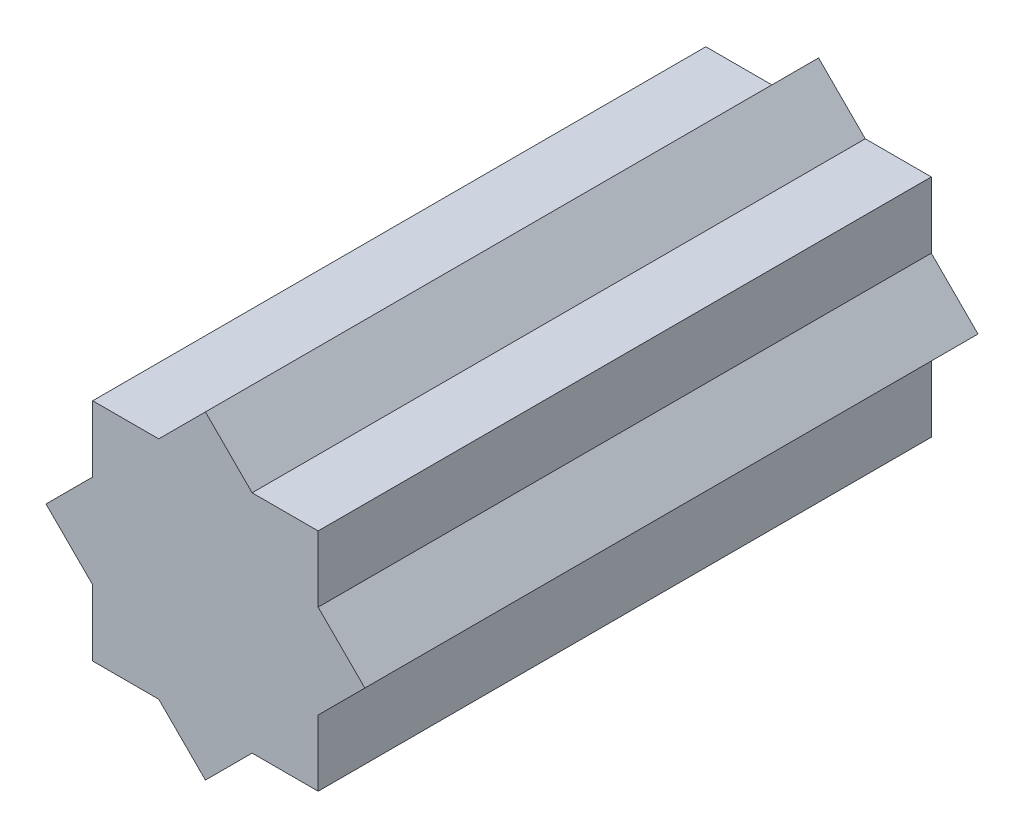
ISO-10303-21;
HEADER;
FILE_DESCRIPTION(('STEP AP214'),'2;1');
FILE_NAME('part.step','',(''),(''),'','','');
FILE_SCHEMA(('AUTOMOTIVE_DESIGN { 1 0 10303 214 1 1 1 1 }'));
ENDSEC;
DATA;
#1=APPLICATION_CONTEXT('core data for automotive mechanical design processes');
#2=APPLICATION_PROTOCOL_DEFINITION('international standard','automotive_design',2000,#1);
#3=PRODUCT_CONTEXT('',#1,'mechanical');
#4=PRODUCT('Part','Part','',(#3));
#5=PRODUCT_RELATED_PRODUCT_CATEGORY('part','',(#4));
#6=PRODUCT_DEFINITION_FORMATION('','',#4);
#7=PRODUCT_DEFINITION_CONTEXT('part definition',#1,'design');
#8=PRODUCT_DEFINITION('design','',#6,#7);
#9=PRODUCT_DEFINITION_SHAPE('','',#8);
#10=(LENGTH_UNIT() NAMED_UNIT(*) SI_UNIT(.MILLI.,.METRE.));
#11=(NAMED_UNIT(*) PLANE_ANGLE_UNIT() SI_UNIT($,.RADIAN.));
#12=(NAMED_UNIT(*) SI_UNIT($,.STERADIAN.) SOLID_ANGLE_UNIT());
#13=UNCERTAINTY_MEASURE_WITH_UNIT(LENGTH_MEASURE(1.E-05),#10,'distance_accuracy_value','');
#14=(GEOMETRIC_REPRESENTATION_CONTEXT(3) GLOBAL_UNCERTAINTY_ASSIGNED_CONTEXT((#13)) GLOBAL_UNIT_ASSIGNED_CONTEXT((#10,
#11,#12)) REPRESENTATION_CONTEXT('',''));
#15=CARTESIAN_POINT('',(0.,0.,0.));
#16=DIRECTION('',(0.,0.,1.));
#17=DIRECTION('',(1.,0.,0.));
#18=AXIS2_PLACEMENT_3D('',#15,#16,#17);
#19=CARTESIAN_POINT('',(-2.75771644662794,2.75771644662794,-7.5));
#20=DIRECTION('',(-1.,0.,0.));
#21=DIRECTION('',(0.,0.,1.));
#22=AXIS2_PLACEMENT_3D('',#19,#20,#21);
#23=PLANE('',#22);
#24=DIRECTION('',(0.,0.,1.));
#25=VECTOR('',#24,1.);
#26=CARTESIAN_POINT('',(-2.75771644662794,1.14228355337206,-7.5));
#27=LINE('',#26,#25);
#28=CARTESIAN_POINT('',(-2.75771644662794,1.14228355337206,-7.5));
#29=VERTEX_POINT('',#28);
#30=CARTESIAN_POINT('',(-2.75771644662794,1.14228355337206,7.5));
#31=VERTEX_POINT('',#30);
#32=EDGE_CURVE('E36',#29,#31,#27,.T.);
#33=ORIENTED_EDGE('',*,*,#32,.T.);
#34=DIRECTION('',(0.,-1.,0.));
#35=VECTOR('',#34,1.);
#36=CARTESIAN_POINT('',(-2.75771644662794,2.75771644662794,7.5));
#37=LINE('',#36,#35);
#38=CARTESIAN_POINT('',(-2.75771644662794,2.75771644662794,7.5));
#39=VERTEX_POINT('',#38);
#40=EDGE_CURVE('E145',#39,#31,#37,.T.);
#41=ORIENTED_EDGE('',*,*,#40,.F.);
#42=DIRECTION('',(0.,0.,1.));
#43=VECTOR('',#42,1.);
#44=CARTESIAN_POINT('',(-2.75771644662794,2.75771644662794,-7.5));
#45=LINE('',#44,#43);
#46=CARTESIAN_POINT('',(-2.75771644662794,2.75771644662794,-7.5));
#47=VERTEX_POINT('',#46);
#48=EDGE_CURVE('E11',#47,#39,#45,.T.);
#49=ORIENTED_EDGE('',*,*,#48,.F.);
#50=DIRECTION('',(0.,-1.,0.));
#51=VECTOR('',#50,1.);
#52=CARTESIAN_POINT('',(-2.75771644662794,2.75771644662794,-7.5));
#53=LINE('',#52,#51);
#54=EDGE_CURVE('E146',#47,#29,#53,.T.);
#55=ORIENTED_EDGE('',*,*,#54,.T.);
#56=EDGE_LOOP('',(#33,#41,#49,#55));
#57=FACE_BOUND('',#56,.T.);
#58=ADVANCED_FACE('F33',(#57),#23,.T.);
#59=CARTESIAN_POINT('',(-2.75771644662794,2.75771644662794,-7.5));
#60=DIRECTION('',(0.,1.,0.));
#61=DIRECTION('',(-1.,0.,0.));
#62=AXIS2_PLACEMENT_3D('',#59,#60,#61);
#63=PLANE('',#62);
#64=ORIENTED_EDGE('',*,*,#48,.T.);
#65=DIRECTION('',(-1.,0.,0.));
#66=VECTOR('',#65,1.);
#67=CARTESIAN_POINT('',(-2.75771644662794,2.75771644662794,7.5));
#68=LINE('',#67,#66);
#69=CARTESIAN_POINT('',(-1.14228355337203,2.75771644662797,7.5));
#70=VERTEX_POINT('',#69);
#71=EDGE_CURVE('E163',#70,#39,#68,.T.);
#72=ORIENTED_EDGE('',*,*,#71,.F.);
#73=DIRECTION('',(0.,0.,1.));
#74=VECTOR('',#73,1.);
#75=CARTESIAN_POINT('',(-1.14228355337203,2.75771644662797,-7.5));
#76=LINE('',#75,#74);
#77=CARTESIAN_POINT('',(-1.14228355337203,2.75771644662797,-7.5));
#78=VERTEX_POINT('',#77);
#79=EDGE_CURVE('E41',#78,#70,#76,.T.);
#80=ORIENTED_EDGE('',*,*,#79,.F.);
#81=DIRECTION('',(-1.,0.,0.));
#82=VECTOR('',#81,1.);
#83=CARTESIAN_POINT('',(-2.75771644662794,2.75771644662794,-7.5));
#84=LINE('',#83,#82);
#85=EDGE_CURVE('E151',#78,#47,#84,.T.);
#86=ORIENTED_EDGE('',*,*,#85,.T.);
#87=EDGE_LOOP('',(#64,#72,#80,#86));
#88=FACE_BOUND('',#87,.T.);
#89=ADVANCED_FACE('F323',(#88),#63,.T.);
#90=CARTESIAN_POINT('',(0.,3.9,-7.5));
#91=DIRECTION('',(-0.707106781186547,0.707106781186548,0.));
#92=DIRECTION('',(-0.707106781186548,-0.707106781186547,0.));
#93=AXIS2_PLACEMENT_3D('',#90,#91,#92);
#94=PLANE('',#93);
#95=ORIENTED_EDGE('',*,*,#79,.T.);
#96=DIRECTION('',(-0.707106781186548,-0.707106781186547,0.));
#97=VECTOR('',#96,1.);
#98=CARTESIAN_POINT('',(0.,3.9,7.5));
#99=LINE('',#98,#97);
#100=CARTESIAN_POINT('',(0.,3.9,7.5));
#101=VERTEX_POINT('',#100);
#102=EDGE_CURVE('E200',#101,#70,#99,.T.);
#103=ORIENTED_EDGE('',*,*,#102,.F.);
#104=DIRECTION('',(0.,0.,1.));
#105=VECTOR('',#104,1.);
#106=CARTESIAN_POINT('',(0.,3.9,-7.5));
#107=LINE('',#106,#105);
#108=CARTESIAN_POINT('',(0.,3.9,-7.5));
#109=VERTEX_POINT('',#108);
#110=EDGE_CURVE('E246',#109,#101,#107,.T.);
#111=ORIENTED_EDGE('',*,*,#110,.F.);
#112=DIRECTION('',(-0.707106781186548,-0.707106781186547,0.));
#113=VECTOR('',#112,1.);
#114=CARTESIAN_POINT('',(0.,3.9,-7.5));
#115=LINE('',#114,#113);
#116=EDGE_CURVE('E242',#109,#78,#115,.T.);
#117=ORIENTED_EDGE('',*,*,#116,.T.);
#118=EDGE_LOOP('',(#95,#103,#111,#117));
#119=FACE_BOUND('',#118,.T.);
#120=ADVANCED_FACE('F321',(#119),#94,.T.);
#121=CARTESIAN_POINT('',(0.,3.9,-7.5));
#122=DIRECTION('',(0.707106781186547,0.707106781186548,0.));
#123=DIRECTION('',(-0.707106781186548,0.707106781186547,0.));
#124=AXIS2_PLACEMENT_3D('',#121,#122,#123);
#125=PLANE('',#124);
#126=ORIENTED_EDGE('',*,*,#110,.T.);
#127=DIRECTION('',(-0.707106781186548,0.707106781186547,0.));
#128=VECTOR('',#127,1.);
#129=CARTESIAN_POINT('',(0.,3.9,7.5));
#130=LINE('',#129,#128);
#131=CARTESIAN_POINT('',(1.14228355337203,2.75771644662797,7.5));
#132=VERTEX_POINT('',#131);
#133=EDGE_CURVE('E197',#132,#101,#130,.T.);
#134=ORIENTED_EDGE('',*,*,#133,.F.);
#135=DIRECTION('',(0.,0.,1.));
#136=VECTOR('',#135,1.);
#137=CARTESIAN_POINT('',(1.14228355337203,2.75771644662797,-7.5));
#138=LINE('',#137,#136);
#139=CARTESIAN_POINT('',(1.14228355337203,2.75771644662797,-7.5));
#140=VERTEX_POINT('',#139);
#141=EDGE_CURVE('E248',#140,#132,#138,.T.);
#142=ORIENTED_EDGE('',*,*,#141,.F.);
#143=DIRECTION('',(-0.707106781186548,0.707106781186547,0.));
#144=VECTOR('',#143,1.);
#145=CARTESIAN_POINT('',(0.,3.9,-7.5));
#146=LINE('',#145,#144);
#147=EDGE_CURVE('E239',#140,#109,#146,.T.);
#148=ORIENTED_EDGE('',*,*,#147,.T.);
#149=EDGE_LOOP('',(#126,#134,#142,#148));
#150=FACE_BOUND('',#149,.T.);
#151=ADVANCED_FACE('F317',(#150),#125,.T.);
#152=CARTESIAN_POINT('',(1.14228355337203,2.75771644662797,-7.5));
#153=DIRECTION('',(0.,1.,0.));
#154=DIRECTION('',(-1.,0.,0.));
#155=AXIS2_PLACEMENT_3D('',#152,#153,#154);
#156=PLANE('',#155);
#157=ORIENTED_EDGE('',*,*,#141,.T.);
#158=DIRECTION('',(-1.,0.,0.));
#159=VECTOR('',#158,1.);
#160=CARTESIAN_POINT('',(1.14228355337203,2.75771644662797,7.5));
#161=LINE('',#160,#159);
#162=CARTESIAN_POINT('',(2.75771644662794,2.75771644662794,7.5));
#163=VERTEX_POINT('',#162);
#164=EDGE_CURVE('E194',#163,#132,#161,.T.);
#165=ORIENTED_EDGE('',*,*,#164,.F.);
#166=DIRECTION('',(0.,0.,1.));
#167=VECTOR('',#166,1.);
#168=CARTESIAN_POINT('',(2.75771644662794,2.75771644662794,-7.5));
#169=LINE('',#168,#167);
#170=CARTESIAN_POINT('',(2.75771644662794,2.75771644662794,-7.5));
#171=VERTEX_POINT('',#170);
#172=EDGE_CURVE('E250',#171,#163,#169,.T.);
#173=ORIENTED_EDGE('',*,*,#172,.F.);
#174=DIRECTION('',(-1.,0.,0.));
#175=VECTOR('',#174,1.);
#176=CARTESIAN_POINT('',(1.14228355337203,2.75771644662797,-7.5));
#177=LINE('',#176,#175);
#178=EDGE_CURVE('E236',#171,#140,#177,.T.);
#179=ORIENTED_EDGE('',*,*,#178,.T.);
#180=EDGE_LOOP('',(#157,#165,#173,#179));
#181=FACE_BOUND('',#180,.T.);
#182=ADVANCED_FACE('F315',(#181),#156,.T.);
#183=CARTESIAN_POINT('',(2.75771644662794,2.75771644662794,-7.5));
#184=DIRECTION('',(1.,0.,0.));
#185=DIRECTION('',(0.,0.,-1.));
#186=AXIS2_PLACEMENT_3D('',#183,#184,#185);
#187=PLANE('',#186);
#188=ORIENTED_EDGE('',*,*,#172,.T.);
#189=DIRECTION('',(0.,1.,0.));
#190=VECTOR('',#189,1.);
#191=CARTESIAN_POINT('',(2.75771644662794,2.75771644662794,7.5));
#192=LINE('',#191,#190);
#193=CARTESIAN_POINT('',(2.75771644662794,1.14228355337206,7.5));
#194=VERTEX_POINT('',#193);
#195=EDGE_CURVE('E191',#194,#163,#192,.T.);
#196=ORIENTED_EDGE('',*,*,#195,.F.);
#197=DIRECTION('',(0.,0.,1.));
#198=VECTOR('',#197,1.);
#199=CARTESIAN_POINT('',(2.75771644662794,1.14228355337206,-7.5));
#200=LINE('',#199,#198);
#201=CARTESIAN_POINT('',(2.75771644662794,1.14228355337206,-7.5));
#202=VERTEX_POINT('',#201);
#203=EDGE_CURVE('E252',#202,#194,#200,.T.);
#204=ORIENTED_EDGE('',*,*,#203,.F.);
#205=DIRECTION('',(0.,1.,0.));
#206=VECTOR('',#205,1.);
#207=CARTESIAN_POINT('',(2.75771644662794,2.75771644662794,-7.5));
#208=LINE('',#207,#206);
#209=EDGE_CURVE('E233',#202,#171,#208,.T.);
#210=ORIENTED_EDGE('',*,*,#209,.T.);
#211=EDGE_LOOP('',(#188,#196,#204,#210));
#212=FACE_BOUND('',#211,.T.);
#213=ADVANCED_FACE('F310',(#212),#187,.T.);
#214=CARTESIAN_POINT('',(2.75771644662794,1.14228355337206,-7.5));
#215=DIRECTION('',(0.707106781186547,0.707106781186548,0.));
#216=DIRECTION('',(-0.707106781186548,0.707106781186547,0.));
#217=AXIS2_PLACEMENT_3D('',#214,#215,#216);
#218=PLANE('',#217);
#219=ORIENTED_EDGE('',*,*,#203,.T.);
#220=DIRECTION('',(-0.707106781186548,0.707106781186547,0.));
#221=VECTOR('',#220,1.);
#222=CARTESIAN_POINT('',(2.75771644662794,1.14228355337206,7.5));
#223=LINE('',#222,#221);
#224=CARTESIAN_POINT('',(3.9,0.,7.5));
#225=VERTEX_POINT('',#224);
#226=EDGE_CURVE('E188',#225,#194,#223,.T.);
#227=ORIENTED_EDGE('',*,*,#226,.F.);
#228=DIRECTION('',(0.,0.,1.));
#229=VECTOR('',#228,1.);
#230=CARTESIAN_POINT('',(3.9,0.,-7.5));
#231=LINE('',#230,#229);
#232=CARTESIAN_POINT('',(3.9,0.,-7.5));
#233=VERTEX_POINT('',#232);
#234=EDGE_CURVE('E254',#233,#225,#231,.T.);
#235=ORIENTED_EDGE('',*,*,#234,.F.);
#236=DIRECTION('',(-0.707106781186548,0.707106781186547,0.));
#237=VECTOR('',#236,1.);
#238=CARTESIAN_POINT('',(2.75771644662794,1.14228355337206,-7.5));
#239=LINE('',#238,#237);
#240=EDGE_CURVE('E230',#233,#202,#239,.T.);
#241=ORIENTED_EDGE('',*,*,#240,.T.);
#242=EDGE_LOOP('',(#219,#227,#235,#241));
#243=FACE_BOUND('',#242,.T.);
#244=ADVANCED_FACE('F305',(#243),#218,.T.);
#245=CARTESIAN_POINT('',(3.9,0.,-7.5));
#246=DIRECTION('',(0.707106781186547,-0.707106781186547,0.));
#247=DIRECTION('',(0.707106781186548,0.707106781186548,0.));
#248=AXIS2_PLACEMENT_3D('',#245,#246,#247);
#249=PLANE('',#248);
#250=ORIENTED_EDGE('',*,*,#234,.T.);
#251=DIRECTION('',(0.707106781186548,0.707106781186548,0.));
#252=VECTOR('',#251,1.);
#253=CARTESIAN_POINT('',(3.9,0.,7.5));
#254=LINE('',#253,#252);
#255=CARTESIAN_POINT('',(2.75771644662794,-1.14228355337206,7.5));
#256=VERTEX_POINT('',#255);
#257=EDGE_CURVE('E185',#256,#225,#254,.T.);
#258=ORIENTED_EDGE('',*,*,#257,.F.);
#259=DIRECTION('',(0.,0.,1.));
#260=VECTOR('',#259,1.);
#261=CARTESIAN_POINT('',(2.75771644662794,-1.14228355337206,-7.5));
#262=LINE('',#261,#260);
#263=CARTESIAN_POINT('',(2.75771644662794,-1.14228355337206,-7.5));
#264=VERTEX_POINT('',#263);
#265=EDGE_CURVE('E256',#264,#256,#262,.T.);
#266=ORIENTED_EDGE('',*,*,#265,.F.);
#267=DIRECTION('',(0.707106781186548,0.707106781186548,0.));
#268=VECTOR('',#267,1.);
#269=CARTESIAN_POINT('',(3.9,0.,-7.5));
#270=LINE('',#269,#268);
#271=EDGE_CURVE('E227',#264,#233,#270,.T.);
#272=ORIENTED_EDGE('',*,*,#271,.T.);
#273=EDGE_LOOP('',(#250,#258,#266,#272));
#274=FACE_BOUND('',#273,.T.);
#275=ADVANCED_FACE('F303',(#274),#249,.T.);
#276=CARTESIAN_POINT('',(2.75771644662794,-1.14228355337206,-7.5));
#277=DIRECTION('',(1.,0.,0.));
#278=DIRECTION('',(0.,1.,0.));
#279=AXIS2_PLACEMENT_3D('',#276,#277,#278);
#280=PLANE('',#279);
#281=ORIENTED_EDGE('',*,*,#265,.T.);
#282=DIRECTION('',(0.,1.,0.));
#283=VECTOR('',#282,1.);
#284=CARTESIAN_POINT('',(2.75771644662794,-1.14228355337206,7.5));
#285=LINE('',#284,#283);
#286=CARTESIAN_POINT('',(2.75771644662794,-2.75771644662794,7.5));
#287=VERTEX_POINT('',#286);
#288=EDGE_CURVE('E182',#287,#256,#285,.T.);
#289=ORIENTED_EDGE('',*,*,#288,.F.);
#290=DIRECTION('',(0.,0.,1.));
#291=VECTOR('',#290,1.);
#292=CARTESIAN_POINT('',(2.75771644662794,-2.75771644662794,-7.5));
#293=LINE('',#292,#291);
#294=CARTESIAN_POINT('',(2.75771644662794,-2.75771644662794,-7.5));
#295=VERTEX_POINT('',#294);
#296=EDGE_CURVE('E258',#295,#287,#293,.T.);
#297=ORIENTED_EDGE('',*,*,#296,.F.);
#298=DIRECTION('',(0.,1.,0.));
#299=VECTOR('',#298,1.);
#300=CARTESIAN_POINT('',(2.75771644662794,-1.14228355337206,-7.5));
#301=LINE('',#300,#299);
#302=EDGE_CURVE('E224',#295,#264,#301,.T.);
#303=ORIENTED_EDGE('',*,*,#302,.T.);
#304=EDGE_LOOP('',(#281,#289,#297,#303));
#305=FACE_BOUND('',#304,.T.);
#306=ADVANCED_FACE('F298',(#305),#280,.T.);
#307=CARTESIAN_POINT('',(1.14228355337206,-2.75771644662794,-7.5));
#308=DIRECTION('',(0.,-1.,0.));
#309=DIRECTION('',(1.,0.,0.));
#310=AXIS2_PLACEMENT_3D('',#307,#308,#309);
#311=PLANE('',#310);
#312=ORIENTED_EDGE('',*,*,#296,.T.);
#313=DIRECTION('',(1.,0.,0.));
#314=VECTOR('',#313,1.);
#315=CARTESIAN_POINT('',(1.14228355337206,-2.75771644662794,7.5));
#316=LINE('',#315,#314);
#317=CARTESIAN_POINT('',(1.14228355337206,-2.75771644662794,7.5));
#318=VERTEX_POINT('',#317);
#319=EDGE_CURVE('E179',#318,#287,#316,.T.);
#320=ORIENTED_EDGE('',*,*,#319,.F.);
#321=DIRECTION('',(0.,0.,1.));
#322=VECTOR('',#321,1.);
#323=CARTESIAN_POINT('',(1.14228355337206,-2.75771644662794,-7.5));
#324=LINE('',#323,#322);
#325=CARTESIAN_POINT('',(1.14228355337206,-2.75771644662794,-7.5));
#326=VERTEX_POINT('',#325);
#327=EDGE_CURVE('E260',#326,#318,#324,.T.);
#328=ORIENTED_EDGE('',*,*,#327,.F.);
#329=DIRECTION('',(1.,0.,0.));
#330=VECTOR('',#329,1.);
#331=CARTESIAN_POINT('',(1.14228355337206,-2.75771644662794,-7.5));
#332=LINE('',#331,#330);
#333=EDGE_CURVE('E221',#326,#295,#332,.T.);
#334=ORIENTED_EDGE('',*,*,#333,.T.);
#335=EDGE_LOOP('',(#312,#320,#328,#334));
#336=FACE_BOUND('',#335,.T.);
#337=ADVANCED_FACE('F293',(#336),#311,.T.);
#338=CARTESIAN_POINT('',(1.14228355337206,-2.75771644662794,-7.5));
#339=DIRECTION('',(0.707106781186548,-0.707106781186547,0.));
#340=DIRECTION('',(0.707106781186547,0.707106781186548,0.));
#341=AXIS2_PLACEMENT_3D('',#338,#339,#340);
#342=PLANE('',#341);
#343=ORIENTED_EDGE('',*,*,#327,.T.);
#344=DIRECTION('',(0.707106781186547,0.707106781186548,0.));
#345=VECTOR('',#344,1.);
#346=CARTESIAN_POINT('',(1.14228355337206,-2.75771644662794,7.5));
#347=LINE('',#346,#345);
#348=CARTESIAN_POINT('',(0.,-3.9,7.5));
#349=VERTEX_POINT('',#348);
#350=EDGE_CURVE('E176',#349,#318,#347,.T.);
#351=ORIENTED_EDGE('',*,*,#350,.F.);
#352=DIRECTION('',(0.,0.,1.));
#353=VECTOR('',#352,1.);
#354=CARTESIAN_POINT('',(0.,-3.9,-7.5));
#355=LINE('',#354,#353);
#356=CARTESIAN_POINT('',(0.,-3.9,-7.5));
#357=VERTEX_POINT('',#356);
#358=EDGE_CURVE('E262',#357,#349,#355,.T.);
#359=ORIENTED_EDGE('',*,*,#358,.F.);
#360=DIRECTION('',(0.707106781186547,0.707106781186548,0.));
#361=VECTOR('',#360,1.);
#362=CARTESIAN_POINT('',(1.14228355337206,-2.75771644662794,-7.5));
#363=LINE('',#362,#361);
#364=EDGE_CURVE('E218',#357,#326,#363,.T.);
#365=ORIENTED_EDGE('',*,*,#364,.T.);
#366=EDGE_LOOP('',(#343,#351,#359,#365));
#367=FACE_BOUND('',#366,.T.);
#368=ADVANCED_FACE('F291',(#367),#342,.T.);
#369=CARTESIAN_POINT('',(-1.14228355337206,-2.75771644662794,-7.5));
#370=DIRECTION('',(-0.707106781186547,-0.707106781186548,0.));
#371=DIRECTION('',(0.707106781186548,-0.707106781186547,0.));
#372=AXIS2_PLACEMENT_3D('',#369,#370,#371);
#373=PLANE('',#372);
#374=ORIENTED_EDGE('',*,*,#358,.T.);
#375=DIRECTION('',(0.707106781186548,-0.707106781186547,0.));
#376=VECTOR('',#375,1.);
#377=CARTESIAN_POINT('',(-1.14228355337206,-2.75771644662794,7.5));
#378=LINE('',#377,#376);
#379=CARTESIAN_POINT('',(-1.14228355337206,-2.75771644662794,7.5));
#380=VERTEX_POINT('',#379);
#381=EDGE_CURVE('E173',#380,#349,#378,.T.);
#382=ORIENTED_EDGE('',*,*,#381,.F.);
#383=DIRECTION('',(0.,0.,1.));
#384=VECTOR('',#383,1.);
#385=CARTESIAN_POINT('',(-1.14228355337206,-2.75771644662794,-7.5));
#386=LINE('',#385,#384);
#387=CARTESIAN_POINT('',(-1.14228355337206,-2.75771644662794,-7.5));
#388=VERTEX_POINT('',#387);
#389=EDGE_CURVE('E264',#388,#380,#386,.T.);
#390=ORIENTED_EDGE('',*,*,#389,.F.);
#391=DIRECTION('',(0.707106781186548,-0.707106781186547,0.));
#392=VECTOR('',#391,1.);
#393=CARTESIAN_POINT('',(-1.14228355337206,-2.75771644662794,-7.5));
#394=LINE('',#393,#392);
#395=EDGE_CURVE('E215',#388,#357,#394,.T.);
#396=ORIENTED_EDGE('',*,*,#395,.T.);
#397=EDGE_LOOP('',(#374,#382,#390,#396));
#398=FACE_BOUND('',#397,.T.);
#399=ADVANCED_FACE('F286',(#398),#373,.T.);
#400=CARTESIAN_POINT('',(-2.75771644662794,-2.75771644662794,-7.5));
#401=DIRECTION('',(0.,-1.,0.));
#402=DIRECTION('',(0.,0.,-1.));
#403=AXIS2_PLACEMENT_3D('',#400,#401,#402);
#404=PLANE('',#403);
#405=ORIENTED_EDGE('',*,*,#389,.T.);
#406=DIRECTION('',(1.,0.,0.));
#407=VECTOR('',#406,1.);
#408=CARTESIAN_POINT('',(-2.75771644662794,-2.75771644662794,7.5));
#409=LINE('',#408,#407);
#410=CARTESIAN_POINT('',(-2.75771644662794,-2.75771644662794,7.5));
#411=VERTEX_POINT('',#410);
#412=EDGE_CURVE('E170',#411,#380,#409,.T.);
#413=ORIENTED_EDGE('',*,*,#412,.F.);
#414=DIRECTION('',(0.,0.,1.));
#415=VECTOR('',#414,1.);
#416=CARTESIAN_POINT('',(-2.75771644662794,-2.75771644662794,-7.5));
#417=LINE('',#416,#415);
#418=CARTESIAN_POINT('',(-2.75771644662794,-2.75771644662794,-7.5));
#419=VERTEX_POINT('',#418);
#420=EDGE_CURVE('E266',#419,#411,#417,.T.);
#421=ORIENTED_EDGE('',*,*,#420,.F.);
#422=DIRECTION('',(1.,0.,0.));
#423=VECTOR('',#422,1.);
#424=CARTESIAN_POINT('',(-2.75771644662794,-2.75771644662794,-7.5));
#425=LINE('',#424,#423);
#426=EDGE_CURVE('E212',#419,#388,#425,.T.);
#427=ORIENTED_EDGE('',*,*,#426,.T.);
#428=EDGE_LOOP('',(#405,#413,#421,#427));
#429=FACE_BOUND('',#428,.T.);
#430=ADVANCED_FACE('F279',(#429),#404,.T.);
#431=CARTESIAN_POINT('',(-2.75771644662794,-1.14228355337206,-7.5));
#432=DIRECTION('',(-1.,0.,0.));
#433=DIRECTION('',(0.,-1.,0.));
#434=AXIS2_PLACEMENT_3D('',#431,#432,#433);
#435=PLANE('',#434);
#436=ORIENTED_EDGE('',*,*,#420,.T.);
#437=DIRECTION('',(0.,-1.,0.));
#438=VECTOR('',#437,1.);
#439=CARTESIAN_POINT('',(-2.75771644662794,-1.14228355337206,7.5));
#440=LINE('',#439,#438);
#441=CARTESIAN_POINT('',(-2.75771644662794,-1.14228355337206,7.5));
#442=VERTEX_POINT('',#441);
#443=EDGE_CURVE('E167',#442,#411,#440,.T.);
#444=ORIENTED_EDGE('',*,*,#443,.F.);
#445=DIRECTION('',(0.,0.,1.));
#446=VECTOR('',#445,1.);
#447=CARTESIAN_POINT('',(-2.75771644662794,-1.14228355337206,-7.5));
#448=LINE('',#447,#446);
#449=CARTESIAN_POINT('',(-2.75771644662794,-1.14228355337206,-7.5));
#450=VERTEX_POINT('',#449);
#451=EDGE_CURVE('E268',#450,#442,#448,.T.);
#452=ORIENTED_EDGE('',*,*,#451,.F.);
#453=DIRECTION('',(0.,-1.,0.));
#454=VECTOR('',#453,1.);
#455=CARTESIAN_POINT('',(-2.75771644662794,-1.14228355337206,-7.5));
#456=LINE('',#455,#454);
#457=EDGE_CURVE('E209',#450,#419,#456,.T.);
#458=ORIENTED_EDGE('',*,*,#457,.T.);
#459=EDGE_LOOP('',(#436,#444,#452,#458));
#460=FACE_BOUND('',#459,.T.);
#461=ADVANCED_FACE('F276',(#460),#435,.T.);
#462=CARTESIAN_POINT('',(-3.9,0.,-7.5));
#463=DIRECTION('',(-0.707106781186547,-0.707106781186547,0.));
#464=DIRECTION('',(0.707106781186548,-0.707106781186548,0.));
#465=AXIS2_PLACEMENT_3D('',#462,#463,#464);
#466=PLANE('',#465);
#467=ORIENTED_EDGE('',*,*,#451,.T.);
#468=DIRECTION('',(0.707106781186548,-0.707106781186548,0.));
#469=VECTOR('',#468,1.);
#470=CARTESIAN_POINT('',(-3.9,0.,7.5));
#471=LINE('',#470,#469);
#472=CARTESIAN_POINT('',(-3.9,0.,7.5));
#473=VERTEX_POINT('',#472);
#474=EDGE_CURVE('E158',#473,#442,#471,.T.);
#475=ORIENTED_EDGE('',*,*,#474,.F.);
#476=DIRECTION('',(0.,0.,1.));
#477=VECTOR('',#476,1.);
#478=CARTESIAN_POINT('',(-3.9,0.,-7.5));
#479=LINE('',#478,#477);
#480=CARTESIAN_POINT('',(-3.9,0.,-7.5));
#481=VERTEX_POINT('',#480);
#482=EDGE_CURVE('E150',#481,#473,#479,.T.);
#483=ORIENTED_EDGE('',*,*,#482,.F.);
#484=DIRECTION('',(0.707106781186548,-0.707106781186548,0.));
#485=VECTOR('',#484,1.);
#486=CARTESIAN_POINT('',(-3.9,0.,-7.5));
#487=LINE('',#486,#485);
#488=EDGE_CURVE('E206',#481,#450,#487,.T.);
#489=ORIENTED_EDGE('',*,*,#488,.T.);
#490=EDGE_LOOP('',(#467,#475,#483,#489));
#491=FACE_BOUND('',#490,.T.);
#492=ADVANCED_FACE('F270',(#491),#466,.T.);
#493=CARTESIAN_POINT('',(-2.75771644662794,1.14228355337206,-7.5));
#494=DIRECTION('',(-0.707106781186547,0.707106781186548,0.));
#495=DIRECTION('',(-0.707106781186548,-0.707106781186547,0.));
#496=AXIS2_PLACEMENT_3D('',#493,#494,#495);
#497=PLANE('',#496);
#498=ORIENTED_EDGE('',*,*,#482,.T.);
#499=DIRECTION('',(-0.707106781186548,-0.707106781186547,0.));
#500=VECTOR('',#499,1.);
#501=CARTESIAN_POINT('',(-2.75771644662794,1.14228355337206,7.5));
#502=LINE('',#501,#500);
#503=EDGE_CURVE('E153',#31,#473,#502,.T.);
#504=ORIENTED_EDGE('',*,*,#503,.F.);
#505=ORIENTED_EDGE('',*,*,#32,.F.);
#506=DIRECTION('',(-0.707106781186548,-0.707106781186547,0.));
#507=VECTOR('',#506,1.);
#508=CARTESIAN_POINT('',(-2.75771644662794,1.14228355337206,-7.5));
#509=LINE('',#508,#507);
#510=EDGE_CURVE('E204',#29,#481,#509,.T.);
#511=ORIENTED_EDGE('',*,*,#510,.T.);
#512=EDGE_LOOP('',(#498,#504,#505,#511));
#513=FACE_BOUND('',#512,.T.);
#514=ADVANCED_FACE('F154',(#513),#497,.T.);
#515=CARTESIAN_POINT('',(0.,0.,-7.5));
#516=DIRECTION('',(0.,0.,1.));
#517=DIRECTION('',(1.,0.,0.));
#518=AXIS2_PLACEMENT_3D('',#515,#516,#517);
#519=PLANE('',#518);
#520=ORIENTED_EDGE('',*,*,#54,.F.);
#521=ORIENTED_EDGE('',*,*,#85,.F.);
#522=ORIENTED_EDGE('',*,*,#116,.F.);
#523=ORIENTED_EDGE('',*,*,#147,.F.);
#524=ORIENTED_EDGE('',*,*,#178,.F.);
#525=ORIENTED_EDGE('',*,*,#209,.F.);
#526=ORIENTED_EDGE('',*,*,#240,.F.);
#527=ORIENTED_EDGE('',*,*,#271,.F.);
#528=ORIENTED_EDGE('',*,*,#302,.F.);
#529=ORIENTED_EDGE('',*,*,#333,.F.);
#530=ORIENTED_EDGE('',*,*,#364,.F.);
#531=ORIENTED_EDGE('',*,*,#395,.F.);
#532=ORIENTED_EDGE('',*,*,#426,.F.);
#533=ORIENTED_EDGE('',*,*,#457,.F.);
#534=ORIENTED_EDGE('',*,*,#488,.F.);
#535=ORIENTED_EDGE('',*,*,#510,.F.);
#536=EDGE_LOOP('',(#520,#521,#522,#523,#524,#525,#526,#527,#528,#529,#530,#531,#532,#533,#534,#535));
#537=FACE_BOUND('',#536,.T.);
#538=ADVANCED_FACE('F282',(#537),#519,.F.);
#539=CARTESIAN_POINT('',(0.,0.,7.5));
#540=DIRECTION('',(0.,0.,1.));
#541=DIRECTION('',(1.,0.,0.));
#542=AXIS2_PLACEMENT_3D('',#539,#540,#541);
#543=PLANE('',#542);
#544=ORIENTED_EDGE('',*,*,#40,.T.);
#545=ORIENTED_EDGE('',*,*,#503,.T.);
#546=ORIENTED_EDGE('',*,*,#474,.T.);
#547=ORIENTED_EDGE('',*,*,#443,.T.);
#548=ORIENTED_EDGE('',*,*,#412,.T.);
#549=ORIENTED_EDGE('',*,*,#381,.T.);
#550=ORIENTED_EDGE('',*,*,#350,.T.);
#551=ORIENTED_EDGE('',*,*,#319,.T.);
#552=ORIENTED_EDGE('',*,*,#288,.T.);
#553=ORIENTED_EDGE('',*,*,#257,.T.);
#554=ORIENTED_EDGE('',*,*,#226,.T.);
#555=ORIENTED_EDGE('',*,*,#195,.T.);
#556=ORIENTED_EDGE('',*,*,#164,.T.);
#557=ORIENTED_EDGE('',*,*,#133,.T.);
#558=ORIENTED_EDGE('',*,*,#102,.T.);
#559=ORIENTED_EDGE('',*,*,#71,.T.);
#560=EDGE_LOOP('',(#544,#545,#546,#547,#548,#549,#550,#551,#552,#553,#554,#555,#556,#557,#558,#559));
#561=FACE_BOUND('',#560,.T.);
#562=ADVANCED_FACE('F161',(#561),#543,.T.);
#563=CLOSED_SHELL('',(#58,#89,#120,#151,#182,#213,#244,#275,#306,#337,#368,#399,#430,#461,#492,
#514,#538,#562));
#564=MANIFOLD_SOLID_BREP('B2',#563);
#565=ADVANCED_BREP_SHAPE_REPRESENTATION('',(#18,#564),#14);
#566=SHAPE_DEFINITION_REPRESENTATION(#9,#565);
ENDSEC;
END-ISO-10303-21;
